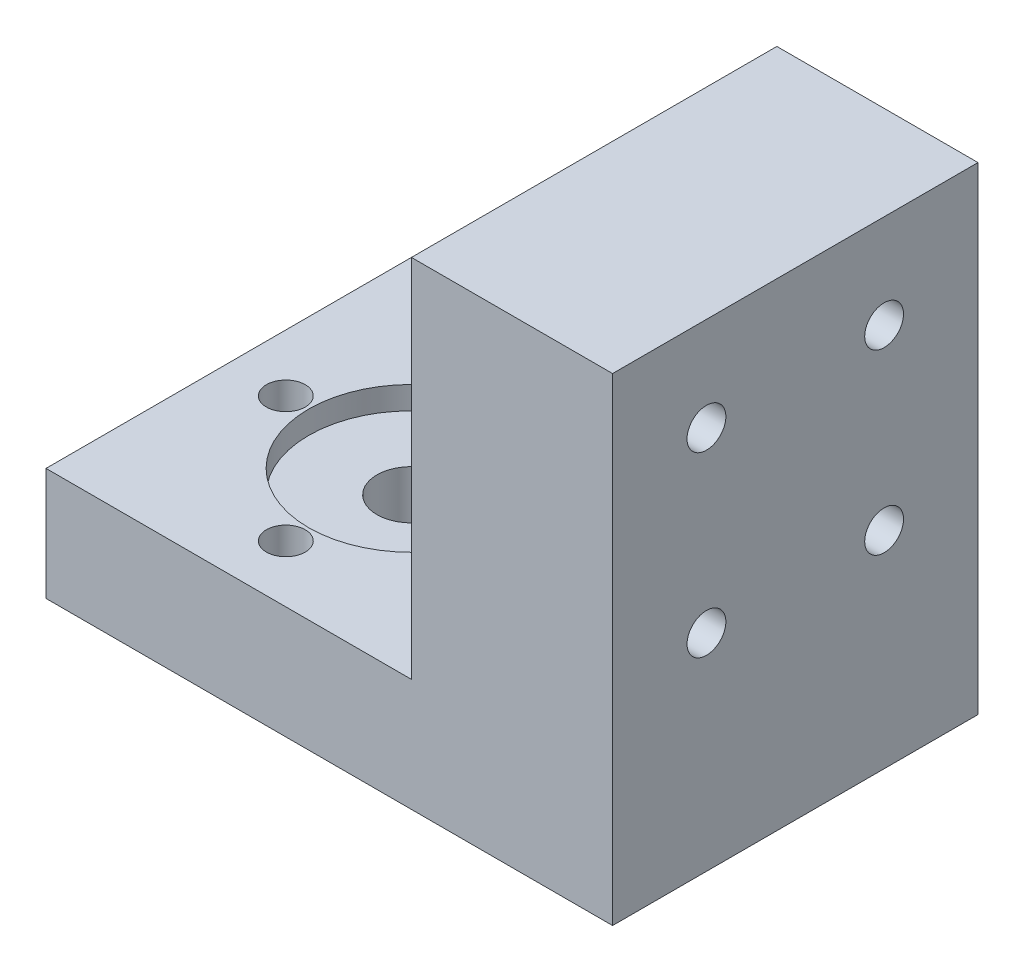
ISO-10303-21;
HEADER;
FILE_DESCRIPTION(('STEP AP214'),'2;1');
FILE_NAME('part.step','',(''),(''),'','','');
FILE_SCHEMA(('AUTOMOTIVE_DESIGN { 1 0 10303 214 1 1 1 1 }'));
ENDSEC;
DATA;
#1=APPLICATION_CONTEXT('core data for automotive mechanical design processes');
#2=APPLICATION_PROTOCOL_DEFINITION('international standard','automotive_design',2000,#1);
#3=PRODUCT_CONTEXT('',#1,'mechanical');
#4=PRODUCT('Part','Part','',(#3));
#5=PRODUCT_RELATED_PRODUCT_CATEGORY('part','',(#4));
#6=PRODUCT_DEFINITION_FORMATION('','',#4);
#7=PRODUCT_DEFINITION_CONTEXT('part definition',#1,'design');
#8=PRODUCT_DEFINITION('design','',#6,#7);
#9=PRODUCT_DEFINITION_SHAPE('','',#8);
#10=(LENGTH_UNIT() NAMED_UNIT(*) SI_UNIT(.MILLI.,.METRE.));
#11=(NAMED_UNIT(*) PLANE_ANGLE_UNIT() SI_UNIT($,.RADIAN.));
#12=(NAMED_UNIT(*) SI_UNIT($,.STERADIAN.) SOLID_ANGLE_UNIT());
#13=UNCERTAINTY_MEASURE_WITH_UNIT(LENGTH_MEASURE(1.E-05),#10,'distance_accuracy_value','');
#14=(GEOMETRIC_REPRESENTATION_CONTEXT(3) GLOBAL_UNCERTAINTY_ASSIGNED_CONTEXT((#13)) GLOBAL_UNIT_ASSIGNED_CONTEXT((#10,
#11,#12)) REPRESENTATION_CONTEXT('',''));
#15=CARTESIAN_POINT('',(0.,0.,0.));
#16=DIRECTION('',(0.,0.,1.));
#17=DIRECTION('',(1.,0.,0.));
#18=AXIS2_PLACEMENT_3D('',#15,#16,#17);
#19=CARTESIAN_POINT('',(0.,-9.86484829732188,0.));
#20=DIRECTION('',(0.,1.,0.));
#21=DIRECTION('',(0.,0.,1.));
#22=AXIS2_PLACEMENT_3D('',#19,#20,#21);
#23=CYLINDRICAL_SURFACE('',#22,3.02);
#24=CARTESIAN_POINT('',(0.,-9.86484829732188,0.));
#25=DIRECTION('',(0.,1.,0.));
#26=DIRECTION('',(0.,0.,1.));
#27=AXIS2_PLACEMENT_3D('',#24,#25,#26);
#28=CIRCLE('',#27,3.02);
#29=CARTESIAN_POINT('',(0.,-9.86484829732188,3.02));
#30=VERTEX_POINT('',#29);
#31=EDGE_CURVE('E108',#30,#30,#28,.T.);
#32=ORIENTED_EDGE('',*,*,#31,.F.);
#33=EDGE_LOOP('',(#32));
#34=FACE_BOUND('',#33,.T.);
#35=CARTESIAN_POINT('',(0.,-2.,0.));
#36=DIRECTION('',(0.,1.,0.));
#37=DIRECTION('',(0.,0.,1.));
#38=AXIS2_PLACEMENT_3D('',#35,#36,#37);
#39=CIRCLE('',#38,3.02);
#40=CARTESIAN_POINT('',(0.,-2.,3.02));
#41=VERTEX_POINT('',#40);
#42=EDGE_CURVE('E48',#41,#41,#39,.F.);
#43=ORIENTED_EDGE('',*,*,#42,.F.);
#44=EDGE_LOOP('',(#43));
#45=FACE_BOUND('',#44,.T.);
#46=ADVANCED_FACE('F42',(#34,#45),#23,.F.);
#47=CARTESIAN_POINT('',(0.,-9.86484829732188,16.));
#48=DIRECTION('',(0.,0.,1.));
#49=DIRECTION('',(1.,0.,0.));
#50=AXIS2_PLACEMENT_3D('',#47,#48,#49);
#51=PLANE('',#50);
#52=DIRECTION('',(1.,0.,0.));
#53=VECTOR('',#52,1.);
#54=CARTESIAN_POINT('',(0.,0.,16.));
#55=LINE('',#54,#53);
#56=CARTESIAN_POINT('',(-16.,0.,16.));
#57=VERTEX_POINT('',#56);
#58=CARTESIAN_POINT('',(16.,0.,16.));
#59=VERTEX_POINT('',#58);
#60=EDGE_CURVE('E90',#57,#59,#55,.T.);
#61=ORIENTED_EDGE('',*,*,#60,.F.);
#62=DIRECTION('',(0.,1.,0.));
#63=VECTOR('',#62,1.);
#64=CARTESIAN_POINT('',(-16.,-9.86484829732188,16.));
#65=LINE('',#64,#63);
#66=CARTESIAN_POINT('',(-16.,-9.86484829732188,16.));
#67=VERTEX_POINT('',#66);
#68=EDGE_CURVE('E11',#67,#57,#65,.T.);
#69=ORIENTED_EDGE('',*,*,#68,.F.);
#70=DIRECTION('',(1.,0.,0.));
#71=VECTOR('',#70,1.);
#72=CARTESIAN_POINT('',(0.,-9.86484829732188,16.));
#73=LINE('',#72,#71);
#74=CARTESIAN_POINT('',(33.6139422083867,-9.86484829732188,16.));
#75=VERTEX_POINT('',#74);
#76=EDGE_CURVE('E201',#67,#75,#73,.T.);
#77=ORIENTED_EDGE('',*,*,#76,.T.);
#78=DIRECTION('',(0.,-1.,0.));
#79=VECTOR('',#78,1.);
#80=CARTESIAN_POINT('',(33.6139422083867,0.,16.));
#81=LINE('',#80,#79);
#82=CARTESIAN_POINT('',(33.6139422083867,32.,16.));
#83=VERTEX_POINT('',#82);
#84=EDGE_CURVE('E171',#83,#75,#81,.T.);
#85=ORIENTED_EDGE('',*,*,#84,.F.);
#86=DIRECTION('',(1.,0.,0.));
#87=VECTOR('',#86,1.);
#88=CARTESIAN_POINT('',(16.,32.,16.));
#89=LINE('',#88,#87);
#90=CARTESIAN_POINT('',(16.,32.,16.));
#91=VERTEX_POINT('',#90);
#92=EDGE_CURVE('E225',#91,#83,#89,.T.);
#93=ORIENTED_EDGE('',*,*,#92,.F.);
#94=DIRECTION('',(0.,-1.,0.));
#95=VECTOR('',#94,1.);
#96=CARTESIAN_POINT('',(16.,32.,16.));
#97=LINE('',#96,#95);
#98=EDGE_CURVE('E98',#91,#59,#97,.T.);
#99=ORIENTED_EDGE('',*,*,#98,.T.);
#100=EDGE_LOOP('',(#61,#69,#77,#85,#93,#99));
#101=FACE_BOUND('',#100,.T.);
#102=ADVANCED_FACE('F92',(#101),#51,.T.);
#103=CARTESIAN_POINT('',(-16.,-9.86484829732188,0.));
#104=DIRECTION('',(1.,0.,0.));
#105=DIRECTION('',(0.,0.,-1.));
#106=AXIS2_PLACEMENT_3D('',#103,#104,#105);
#107=PLANE('',#106);
#108=DIRECTION('',(0.,0.,-1.));
#109=VECTOR('',#108,1.);
#110=CARTESIAN_POINT('',(-16.,0.,0.));
#111=LINE('',#110,#109);
#112=CARTESIAN_POINT('',(-16.,0.,-16.));
#113=VERTEX_POINT('',#112);
#114=EDGE_CURVE('E82',#57,#113,#111,.T.);
#115=ORIENTED_EDGE('',*,*,#114,.T.);
#116=DIRECTION('',(0.,1.,0.));
#117=VECTOR('',#116,1.);
#118=CARTESIAN_POINT('',(-16.,-9.86484829732188,-16.));
#119=LINE('',#118,#117);
#120=CARTESIAN_POINT('',(-16.,-9.86484829732188,-16.));
#121=VERTEX_POINT('',#120);
#122=EDGE_CURVE('E52',#121,#113,#119,.T.);
#123=ORIENTED_EDGE('',*,*,#122,.F.);
#124=DIRECTION('',(0.,0.,-1.));
#125=VECTOR('',#124,1.);
#126=CARTESIAN_POINT('',(-16.,-9.86484829732188,0.));
#127=LINE('',#126,#125);
#128=EDGE_CURVE('E83',#67,#121,#127,.T.);
#129=ORIENTED_EDGE('',*,*,#128,.F.);
#130=ORIENTED_EDGE('',*,*,#68,.T.);
#131=EDGE_LOOP('',(#115,#123,#129,#130));
#132=FACE_BOUND('',#131,.T.);
#133=ADVANCED_FACE('F76',(#132),#107,.F.);
#134=CARTESIAN_POINT('',(0.,-9.86484829732188,-16.));
#135=DIRECTION('',(0.,0.,1.));
#136=DIRECTION('',(1.,0.,0.));
#137=AXIS2_PLACEMENT_3D('',#134,#135,#136);
#138=PLANE('',#137);
#139=DIRECTION('',(1.,0.,0.));
#140=VECTOR('',#139,1.);
#141=CARTESIAN_POINT('',(0.,0.,-16.));
#142=LINE('',#141,#140);
#143=CARTESIAN_POINT('',(16.,0.,-16.));
#144=VERTEX_POINT('',#143);
#145=EDGE_CURVE('E93',#113,#144,#142,.T.);
#146=ORIENTED_EDGE('',*,*,#145,.T.);
#147=DIRECTION('',(0.,-1.,0.));
#148=VECTOR('',#147,1.);
#149=CARTESIAN_POINT('',(16.,32.,-16.));
#150=LINE('',#149,#148);
#151=CARTESIAN_POINT('',(16.,32.,-16.));
#152=VERTEX_POINT('',#151);
#153=EDGE_CURVE('E170',#152,#144,#150,.T.);
#154=ORIENTED_EDGE('',*,*,#153,.F.);
#155=DIRECTION('',(-1.,0.,0.));
#156=VECTOR('',#155,1.);
#157=CARTESIAN_POINT('',(16.,32.,-16.));
#158=LINE('',#157,#156);
#159=CARTESIAN_POINT('',(33.6139422083867,32.,-16.));
#160=VERTEX_POINT('',#159);
#161=EDGE_CURVE('E173',#160,#152,#158,.T.);
#162=ORIENTED_EDGE('',*,*,#161,.F.);
#163=DIRECTION('',(0.,1.,0.));
#164=VECTOR('',#163,1.);
#165=CARTESIAN_POINT('',(33.6139422083867,0.,-16.));
#166=LINE('',#165,#164);
#167=CARTESIAN_POINT('',(33.6139422083867,-9.86484829732188,-16.));
#168=VERTEX_POINT('',#167);
#169=EDGE_CURVE('E190',#168,#160,#166,.T.);
#170=ORIENTED_EDGE('',*,*,#169,.F.);
#171=DIRECTION('',(1.,0.,0.));
#172=VECTOR('',#171,1.);
#173=CARTESIAN_POINT('',(0.,-9.86484829732188,-16.));
#174=LINE('',#173,#172);
#175=EDGE_CURVE('E202',#121,#168,#174,.T.);
#176=ORIENTED_EDGE('',*,*,#175,.F.);
#177=ORIENTED_EDGE('',*,*,#122,.T.);
#178=EDGE_LOOP('',(#146,#154,#162,#170,#176,#177));
#179=FACE_BOUND('',#178,.T.);
#180=ADVANCED_FACE('F154',(#179),#138,.F.);
#181=CARTESIAN_POINT('',(-11.,-9.86484829732188,0.));
#182=DIRECTION('',(0.,1.,0.));
#183=DIRECTION('',(0.,0.,1.));
#184=AXIS2_PLACEMENT_3D('',#181,#182,#183);
#185=CYLINDRICAL_SURFACE('',#184,1.7);
#186=CARTESIAN_POINT('',(-11.,-9.86484829732188,0.));
#187=DIRECTION('',(0.,1.,0.));
#188=DIRECTION('',(0.,0.,1.));
#189=AXIS2_PLACEMENT_3D('',#186,#187,#188);
#190=CIRCLE('',#189,1.7);
#191=CARTESIAN_POINT('',(-11.,-9.86484829732188,1.7));
#192=VERTEX_POINT('',#191);
#193=EDGE_CURVE('E115',#192,#192,#190,.F.);
#194=ORIENTED_EDGE('',*,*,#193,.T.);
#195=EDGE_LOOP('',(#194));
#196=FACE_BOUND('',#195,.T.);
#197=CARTESIAN_POINT('',(-11.,0.,0.));
#198=DIRECTION('',(0.,1.,0.));
#199=DIRECTION('',(0.,0.,1.));
#200=AXIS2_PLACEMENT_3D('',#197,#198,#199);
#201=CIRCLE('',#200,1.7);
#202=CARTESIAN_POINT('',(-11.,0.,1.7));
#203=VERTEX_POINT('',#202);
#204=EDGE_CURVE('E91',#203,#203,#201,.F.);
#205=ORIENTED_EDGE('',*,*,#204,.F.);
#206=EDGE_LOOP('',(#205));
#207=FACE_BOUND('',#206,.T.);
#208=ADVANCED_FACE('F137',(#196,#207),#185,.F.);
#209=CARTESIAN_POINT('',(0.,-9.86484829732188,11.));
#210=DIRECTION('',(0.,1.,0.));
#211=DIRECTION('',(0.,0.,1.));
#212=AXIS2_PLACEMENT_3D('',#209,#210,#211);
#213=CYLINDRICAL_SURFACE('',#212,1.7);
#214=CARTESIAN_POINT('',(0.,-9.86484829732188,11.));
#215=DIRECTION('',(0.,1.,0.));
#216=DIRECTION('',(0.,0.,1.));
#217=AXIS2_PLACEMENT_3D('',#214,#215,#216);
#218=CIRCLE('',#217,1.7);
#219=CARTESIAN_POINT('',(0.,-9.86484829732188,12.7));
#220=VERTEX_POINT('',#219);
#221=EDGE_CURVE('E199',#220,#220,#218,.T.);
#222=ORIENTED_EDGE('',*,*,#221,.F.);
#223=EDGE_LOOP('',(#222));
#224=FACE_BOUND('',#223,.T.);
#225=CARTESIAN_POINT('',(0.,0.,11.));
#226=DIRECTION('',(0.,1.,0.));
#227=DIRECTION('',(0.,0.,1.));
#228=AXIS2_PLACEMENT_3D('',#225,#226,#227);
#229=CIRCLE('',#228,1.7);
#230=CARTESIAN_POINT('',(0.,0.,12.7));
#231=VERTEX_POINT('',#230);
#232=EDGE_CURVE('E97',#231,#231,#229,.T.);
#233=ORIENTED_EDGE('',*,*,#232,.T.);
#234=EDGE_LOOP('',(#233));
#235=FACE_BOUND('',#234,.T.);
#236=ADVANCED_FACE('F129',(#224,#235),#213,.F.);
#237=CARTESIAN_POINT('',(11.,-9.86484829732188,0.));
#238=DIRECTION('',(0.,1.,0.));
#239=DIRECTION('',(0.,0.,1.));
#240=AXIS2_PLACEMENT_3D('',#237,#238,#239);
#241=CYLINDRICAL_SURFACE('',#240,1.7);
#242=CARTESIAN_POINT('',(11.,-9.86484829732188,0.));
#243=DIRECTION('',(0.,1.,0.));
#244=DIRECTION('',(0.,0.,1.));
#245=AXIS2_PLACEMENT_3D('',#242,#243,#244);
#246=CIRCLE('',#245,1.7);
#247=CARTESIAN_POINT('',(11.,-9.86484829732188,1.7));
#248=VERTEX_POINT('',#247);
#249=EDGE_CURVE('E196',#248,#248,#246,.F.);
#250=ORIENTED_EDGE('',*,*,#249,.T.);
#251=EDGE_LOOP('',(#250));
#252=FACE_BOUND('',#251,.T.);
#253=CARTESIAN_POINT('',(11.,0.,0.));
#254=DIRECTION('',(0.,1.,0.));
#255=DIRECTION('',(0.,0.,1.));
#256=AXIS2_PLACEMENT_3D('',#253,#254,#255);
#257=CIRCLE('',#256,1.7);
#258=CARTESIAN_POINT('',(11.,0.,1.7));
#259=VERTEX_POINT('',#258);
#260=EDGE_CURVE('E103',#259,#259,#257,.F.);
#261=ORIENTED_EDGE('',*,*,#260,.F.);
#262=EDGE_LOOP('',(#261));
#263=FACE_BOUND('',#262,.T.);
#264=ADVANCED_FACE('F130',(#252,#263),#241,.F.);
#265=CARTESIAN_POINT('',(0.,-9.86484829732188,-11.));
#266=DIRECTION('',(0.,1.,0.));
#267=DIRECTION('',(0.,0.,1.));
#268=AXIS2_PLACEMENT_3D('',#265,#266,#267);
#269=CYLINDRICAL_SURFACE('',#268,1.7);
#270=CARTESIAN_POINT('',(0.,-9.86484829732188,-11.));
#271=DIRECTION('',(0.,1.,0.));
#272=DIRECTION('',(0.,0.,1.));
#273=AXIS2_PLACEMENT_3D('',#270,#271,#272);
#274=CIRCLE('',#273,1.7);
#275=CARTESIAN_POINT('',(0.,-9.86484829732188,-9.3));
#276=VERTEX_POINT('',#275);
#277=EDGE_CURVE('E107',#276,#276,#274,.T.);
#278=ORIENTED_EDGE('',*,*,#277,.F.);
#279=EDGE_LOOP('',(#278));
#280=FACE_BOUND('',#279,.T.);
#281=CARTESIAN_POINT('',(0.,0.,-11.));
#282=DIRECTION('',(0.,1.,0.));
#283=DIRECTION('',(0.,0.,1.));
#284=AXIS2_PLACEMENT_3D('',#281,#282,#283);
#285=CIRCLE('',#284,1.7);
#286=CARTESIAN_POINT('',(0.,0.,-9.3));
#287=VERTEX_POINT('',#286);
#288=EDGE_CURVE('E116',#287,#287,#285,.T.);
#289=ORIENTED_EDGE('',*,*,#288,.T.);
#290=EDGE_LOOP('',(#289));
#291=FACE_BOUND('',#290,.T.);
#292=ADVANCED_FACE('F46',(#280,#291),#269,.F.);
#293=CARTESIAN_POINT('',(0.,-9.86484829732188,0.));
#294=DIRECTION('',(0.,1.,0.));
#295=DIRECTION('',(0.,0.,1.));
#296=AXIS2_PLACEMENT_3D('',#293,#294,#295);
#297=PLANE('',#296);
#298=ORIENTED_EDGE('',*,*,#277,.T.);
#299=EDGE_LOOP('',(#298));
#300=FACE_BOUND('',#299,.T.);
#301=ORIENTED_EDGE('',*,*,#249,.F.);
#302=EDGE_LOOP('',(#301));
#303=FACE_BOUND('',#302,.T.);
#304=ORIENTED_EDGE('',*,*,#221,.T.);
#305=EDGE_LOOP('',(#304));
#306=FACE_BOUND('',#305,.T.);
#307=ORIENTED_EDGE('',*,*,#76,.F.);
#308=ORIENTED_EDGE('',*,*,#128,.T.);
#309=ORIENTED_EDGE('',*,*,#175,.T.);
#310=DIRECTION('',(0.,0.,-1.));
#311=VECTOR('',#310,1.);
#312=CARTESIAN_POINT('',(33.6139422083867,-9.86484829732188,16.));
#313=LINE('',#312,#311);
#314=EDGE_CURVE('E184',#75,#168,#313,.T.);
#315=ORIENTED_EDGE('',*,*,#314,.F.);
#316=EDGE_LOOP('',(#307,#308,#309,#315));
#317=FACE_BOUND('',#316,.T.);
#318=ORIENTED_EDGE('',*,*,#193,.F.);
#319=EDGE_LOOP('',(#318));
#320=FACE_BOUND('',#319,.T.);
#321=ORIENTED_EDGE('',*,*,#31,.T.);
#322=EDGE_LOOP('',(#321));
#323=FACE_BOUND('',#322,.T.);
#324=ADVANCED_FACE('F131',(#300,#303,#306,#317,#320,#323),#297,.F.);
#325=CARTESIAN_POINT('',(0.,0.,0.));
#326=DIRECTION('',(0.,1.,0.));
#327=DIRECTION('',(0.,0.,1.));
#328=AXIS2_PLACEMENT_3D('',#325,#326,#327);
#329=PLANE('',#328);
#330=DIRECTION('',(0.,0.,1.));
#331=VECTOR('',#330,1.);
#332=CARTESIAN_POINT('',(16.,0.,-16.));
#333=LINE('',#332,#331);
#334=EDGE_CURVE('E62',#144,#59,#333,.T.);
#335=ORIENTED_EDGE('',*,*,#334,.F.);
#336=ORIENTED_EDGE('',*,*,#145,.F.);
#337=ORIENTED_EDGE('',*,*,#114,.F.);
#338=ORIENTED_EDGE('',*,*,#60,.T.);
#339=EDGE_LOOP('',(#335,#336,#337,#338));
#340=FACE_BOUND('',#339,.T.);
#341=CARTESIAN_POINT('',(0.,0.,0.));
#342=DIRECTION('',(0.,1.,0.));
#343=DIRECTION('',(0.,0.,1.));
#344=AXIS2_PLACEMENT_3D('',#341,#342,#343);
#345=CIRCLE('',#344,9.);
#346=CARTESIAN_POINT('',(0.,0.,9.));
#347=VERTEX_POINT('',#346);
#348=EDGE_CURVE('E186',#347,#347,#345,.T.);
#349=ORIENTED_EDGE('',*,*,#348,.F.);
#350=EDGE_LOOP('',(#349));
#351=FACE_BOUND('',#350,.T.);
#352=ORIENTED_EDGE('',*,*,#288,.F.);
#353=EDGE_LOOP('',(#352));
#354=FACE_BOUND('',#353,.T.);
#355=ORIENTED_EDGE('',*,*,#260,.T.);
#356=EDGE_LOOP('',(#355));
#357=FACE_BOUND('',#356,.T.);
#358=ORIENTED_EDGE('',*,*,#232,.F.);
#359=EDGE_LOOP('',(#358));
#360=FACE_BOUND('',#359,.T.);
#361=ORIENTED_EDGE('',*,*,#204,.T.);
#362=EDGE_LOOP('',(#361));
#363=FACE_BOUND('',#362,.T.);
#364=ADVANCED_FACE('F88',(#340,#351,#354,#357,#360,#363),#329,.T.);
#365=CARTESIAN_POINT('',(0.,-2.,0.));
#366=DIRECTION('',(0.,1.,0.));
#367=DIRECTION('',(0.,0.,1.));
#368=AXIS2_PLACEMENT_3D('',#365,#366,#367);
#369=PLANE('',#368);
#370=CARTESIAN_POINT('',(0.,-2.,0.));
#371=DIRECTION('',(0.,1.,0.));
#372=DIRECTION('',(0.,0.,1.));
#373=AXIS2_PLACEMENT_3D('',#370,#371,#372);
#374=CIRCLE('',#373,9.);
#375=CARTESIAN_POINT('',(0.,-2.,9.));
#376=VERTEX_POINT('',#375);
#377=EDGE_CURVE('E191',#376,#376,#374,.T.);
#378=ORIENTED_EDGE('',*,*,#377,.T.);
#379=EDGE_LOOP('',(#378));
#380=FACE_BOUND('',#379,.T.);
#381=ORIENTED_EDGE('',*,*,#42,.T.);
#382=EDGE_LOOP('',(#381));
#383=FACE_BOUND('',#382,.T.);
#384=ADVANCED_FACE('F249',(#380,#383),#369,.T.);
#385=CARTESIAN_POINT('',(0.,-2.,0.));
#386=DIRECTION('',(0.,1.,0.));
#387=DIRECTION('',(0.,0.,1.));
#388=AXIS2_PLACEMENT_3D('',#385,#386,#387);
#389=CYLINDRICAL_SURFACE('',#388,9.);
#390=ORIENTED_EDGE('',*,*,#377,.F.);
#391=EDGE_LOOP('',(#390));
#392=FACE_BOUND('',#391,.T.);
#393=ORIENTED_EDGE('',*,*,#348,.T.);
#394=EDGE_LOOP('',(#393));
#395=FACE_BOUND('',#394,.T.);
#396=ADVANCED_FACE('F236',(#392,#395),#389,.F.);
#397=CARTESIAN_POINT('',(33.6139422083867,0.,0.));
#398=DIRECTION('',(1.,0.,0.));
#399=DIRECTION('',(0.,0.,-1.));
#400=AXIS2_PLACEMENT_3D('',#397,#398,#399);
#401=PLANE('',#400);
#402=CARTESIAN_POINT('',(33.6139422083867,23.7781745930524,7.77817459305201));
#403=DIRECTION('',(-1.,0.,0.));
#404=DIRECTION('',(0.,0.,1.));
#405=AXIS2_PLACEMENT_3D('',#402,#403,#404);
#406=CIRCLE('',#405,1.7);
#407=CARTESIAN_POINT('',(33.6139422083867,23.7781745930524,9.47817459305201));
#408=VERTEX_POINT('',#407);
#409=EDGE_CURVE('E332',#408,#408,#406,.T.);
#410=ORIENTED_EDGE('',*,*,#409,.T.);
#411=EDGE_LOOP('',(#410));
#412=FACE_BOUND('',#411,.T.);
#413=CARTESIAN_POINT('',(33.6139422083867,8.2218254069483,7.77817459305234));
#414=DIRECTION('',(-1.,0.,0.));
#415=DIRECTION('',(0.,0.,1.));
#416=AXIS2_PLACEMENT_3D('',#413,#414,#415);
#417=CIRCLE('',#416,1.7);
#418=CARTESIAN_POINT('',(33.6139422083867,8.2218254069483,9.47817459305234));
#419=VERTEX_POINT('',#418);
#420=EDGE_CURVE('E333',#419,#419,#417,.T.);
#421=ORIENTED_EDGE('',*,*,#420,.T.);
#422=EDGE_LOOP('',(#421));
#423=FACE_BOUND('',#422,.T.);
#424=CARTESIAN_POINT('',(33.6139422083867,8.22182540694802,-7.77817459305173));
#425=DIRECTION('',(-1.,0.,0.));
#426=DIRECTION('',(0.,0.,1.));
#427=AXIS2_PLACEMENT_3D('',#424,#425,#426);
#428=CIRCLE('',#427,1.7);
#429=CARTESIAN_POINT('',(33.6139422083867,8.22182540694802,-6.07817459305173));
#430=VERTEX_POINT('',#429);
#431=EDGE_CURVE('E348',#430,#430,#428,.T.);
#432=ORIENTED_EDGE('',*,*,#431,.T.);
#433=EDGE_LOOP('',(#432));
#434=FACE_BOUND('',#433,.T.);
#435=CARTESIAN_POINT('',(33.6139422083867,23.778174593052,-7.77817459305206));
#436=DIRECTION('',(-1.,0.,0.));
#437=DIRECTION('',(0.,0.,1.));
#438=AXIS2_PLACEMENT_3D('',#435,#436,#437);
#439=CIRCLE('',#438,1.7);
#440=CARTESIAN_POINT('',(33.6139422083867,23.778174593052,-6.07817459305206));
#441=VERTEX_POINT('',#440);
#442=EDGE_CURVE('E229',#441,#441,#439,.T.);
#443=ORIENTED_EDGE('',*,*,#442,.T.);
#444=EDGE_LOOP('',(#443));
#445=FACE_BOUND('',#444,.T.);
#446=ORIENTED_EDGE('',*,*,#84,.T.);
#447=ORIENTED_EDGE('',*,*,#314,.T.);
#448=ORIENTED_EDGE('',*,*,#169,.T.);
#449=DIRECTION('',(0.,0.,-1.));
#450=VECTOR('',#449,1.);
#451=CARTESIAN_POINT('',(33.6139422083867,32.,-16.));
#452=LINE('',#451,#450);
#453=EDGE_CURVE('E179',#83,#160,#452,.T.);
#454=ORIENTED_EDGE('',*,*,#453,.F.);
#455=EDGE_LOOP('',(#446,#447,#448,#454));
#456=FACE_BOUND('',#455,.T.);
#457=ADVANCED_FACE('F237',(#412,#423,#434,#445,#456),#401,.T.);
#458=CARTESIAN_POINT('',(16.,32.,-16.));
#459=DIRECTION('',(1.,0.,0.));
#460=DIRECTION('',(0.,0.,-1.));
#461=AXIS2_PLACEMENT_3D('',#458,#459,#460);
#462=PLANE('',#461);
#463=CARTESIAN_POINT('',(16.,23.7781745930524,7.77817459305201));
#464=DIRECTION('',(-1.,0.,0.));
#465=DIRECTION('',(0.,0.,1.));
#466=AXIS2_PLACEMENT_3D('',#463,#464,#465);
#467=CIRCLE('',#466,1.7);
#468=CARTESIAN_POINT('',(16.,23.7781745930524,9.47817459305201));
#469=VERTEX_POINT('',#468);
#470=EDGE_CURVE('E331',#469,#469,#467,.T.);
#471=ORIENTED_EDGE('',*,*,#470,.F.);
#472=EDGE_LOOP('',(#471));
#473=FACE_BOUND('',#472,.T.);
#474=CARTESIAN_POINT('',(16.,8.2218254069483,7.77817459305234));
#475=DIRECTION('',(-1.,0.,0.));
#476=DIRECTION('',(0.,0.,1.));
#477=AXIS2_PLACEMENT_3D('',#474,#475,#476);
#478=CIRCLE('',#477,1.7);
#479=CARTESIAN_POINT('',(16.,8.2218254069483,9.47817459305234));
#480=VERTEX_POINT('',#479);
#481=EDGE_CURVE('E338',#480,#480,#478,.T.);
#482=ORIENTED_EDGE('',*,*,#481,.F.);
#483=EDGE_LOOP('',(#482));
#484=FACE_BOUND('',#483,.T.);
#485=CARTESIAN_POINT('',(16.,8.22182540694802,-7.77817459305173));
#486=DIRECTION('',(-1.,0.,0.));
#487=DIRECTION('',(0.,0.,1.));
#488=AXIS2_PLACEMENT_3D('',#485,#486,#487);
#489=CIRCLE('',#488,1.7);
#490=CARTESIAN_POINT('',(16.,8.22182540694802,-6.07817459305173));
#491=VERTEX_POINT('',#490);
#492=EDGE_CURVE('E347',#491,#491,#489,.T.);
#493=ORIENTED_EDGE('',*,*,#492,.F.);
#494=EDGE_LOOP('',(#493));
#495=FACE_BOUND('',#494,.T.);
#496=CARTESIAN_POINT('',(16.,23.778174593052,-7.77817459305206));
#497=DIRECTION('',(-1.,0.,0.));
#498=DIRECTION('',(0.,0.,1.));
#499=AXIS2_PLACEMENT_3D('',#496,#497,#498);
#500=CIRCLE('',#499,1.7);
#501=CARTESIAN_POINT('',(16.,23.778174593052,-6.07817459305206));
#502=VERTEX_POINT('',#501);
#503=EDGE_CURVE('E231',#502,#502,#500,.T.);
#504=ORIENTED_EDGE('',*,*,#503,.F.);
#505=EDGE_LOOP('',(#504));
#506=FACE_BOUND('',#505,.T.);
#507=ORIENTED_EDGE('',*,*,#334,.T.);
#508=ORIENTED_EDGE('',*,*,#98,.F.);
#509=DIRECTION('',(0.,0.,1.));
#510=VECTOR('',#509,1.);
#511=CARTESIAN_POINT('',(16.,32.,-16.));
#512=LINE('',#511,#510);
#513=EDGE_CURVE('E175',#152,#91,#512,.T.);
#514=ORIENTED_EDGE('',*,*,#513,.F.);
#515=ORIENTED_EDGE('',*,*,#153,.T.);
#516=EDGE_LOOP('',(#507,#508,#514,#515));
#517=FACE_BOUND('',#516,.T.);
#518=ADVANCED_FACE('F168',(#473,#484,#495,#506,#517),#462,.F.);
#519=CARTESIAN_POINT('',(0.,32.,0.));
#520=DIRECTION('',(0.,1.,0.));
#521=DIRECTION('',(0.,0.,1.));
#522=AXIS2_PLACEMENT_3D('',#519,#520,#521);
#523=PLANE('',#522);
#524=ORIENTED_EDGE('',*,*,#513,.T.);
#525=ORIENTED_EDGE('',*,*,#92,.T.);
#526=ORIENTED_EDGE('',*,*,#453,.T.);
#527=ORIENTED_EDGE('',*,*,#161,.T.);
#528=EDGE_LOOP('',(#524,#525,#526,#527));
#529=FACE_BOUND('',#528,.T.);
#530=ADVANCED_FACE('F230',(#529),#523,.T.);
#531=CARTESIAN_POINT('',(33.6139422083867,23.778174593052,-7.77817459305206));
#532=DIRECTION('',(-1.,0.,0.));
#533=DIRECTION('',(0.,0.,1.));
#534=AXIS2_PLACEMENT_3D('',#531,#532,#533);
#535=CYLINDRICAL_SURFACE('',#534,1.7);
#536=ORIENTED_EDGE('',*,*,#442,.F.);
#537=EDGE_LOOP('',(#536));
#538=FACE_BOUND('',#537,.T.);
#539=ORIENTED_EDGE('',*,*,#503,.T.);
#540=EDGE_LOOP('',(#539));
#541=FACE_BOUND('',#540,.T.);
#542=ADVANCED_FACE('F282',(#538,#541),#535,.F.);
#543=CARTESIAN_POINT('',(33.6139422083867,8.22182540694802,-7.77817459305173));
#544=DIRECTION('',(-1.,0.,0.));
#545=DIRECTION('',(0.,0.,1.));
#546=AXIS2_PLACEMENT_3D('',#543,#544,#545);
#547=CYLINDRICAL_SURFACE('',#546,1.7);
#548=ORIENTED_EDGE('',*,*,#431,.F.);
#549=EDGE_LOOP('',(#548));
#550=FACE_BOUND('',#549,.T.);
#551=ORIENTED_EDGE('',*,*,#492,.T.);
#552=EDGE_LOOP('',(#551));
#553=FACE_BOUND('',#552,.T.);
#554=ADVANCED_FACE('F297',(#550,#553),#547,.F.);
#555=CARTESIAN_POINT('',(33.6139422083867,8.2218254069483,7.77817459305234));
#556=DIRECTION('',(-1.,0.,0.));
#557=DIRECTION('',(0.,0.,1.));
#558=AXIS2_PLACEMENT_3D('',#555,#556,#557);
#559=CYLINDRICAL_SURFACE('',#558,1.7);
#560=ORIENTED_EDGE('',*,*,#420,.F.);
#561=EDGE_LOOP('',(#560));
#562=FACE_BOUND('',#561,.T.);
#563=ORIENTED_EDGE('',*,*,#481,.T.);
#564=EDGE_LOOP('',(#563));
#565=FACE_BOUND('',#564,.T.);
#566=ADVANCED_FACE('F308',(#562,#565),#559,.F.);
#567=CARTESIAN_POINT('',(33.6139422083867,23.7781745930524,7.77817459305201));
#568=DIRECTION('',(-1.,0.,0.));
#569=DIRECTION('',(0.,0.,1.));
#570=AXIS2_PLACEMENT_3D('',#567,#568,#569);
#571=CYLINDRICAL_SURFACE('',#570,1.7);
#572=ORIENTED_EDGE('',*,*,#409,.F.);
#573=EDGE_LOOP('',(#572));
#574=FACE_BOUND('',#573,.T.);
#575=ORIENTED_EDGE('',*,*,#470,.T.);
#576=EDGE_LOOP('',(#575));
#577=FACE_BOUND('',#576,.T.);
#578=ADVANCED_FACE('F316',(#574,#577),#571,.F.);
#579=CLOSED_SHELL('',(#46,#102,#133,#180,#208,#236,#264,#292,#324,#364,#384,#396,#457,#518,#530,
#542,#554,#566,#578));
#580=MANIFOLD_SOLID_BREP('B2',#579);
#581=ADVANCED_BREP_SHAPE_REPRESENTATION('',(#18,#580),#14);
#582=SHAPE_DEFINITION_REPRESENTATION(#9,#581);
ENDSEC;
END-ISO-10303-21;
